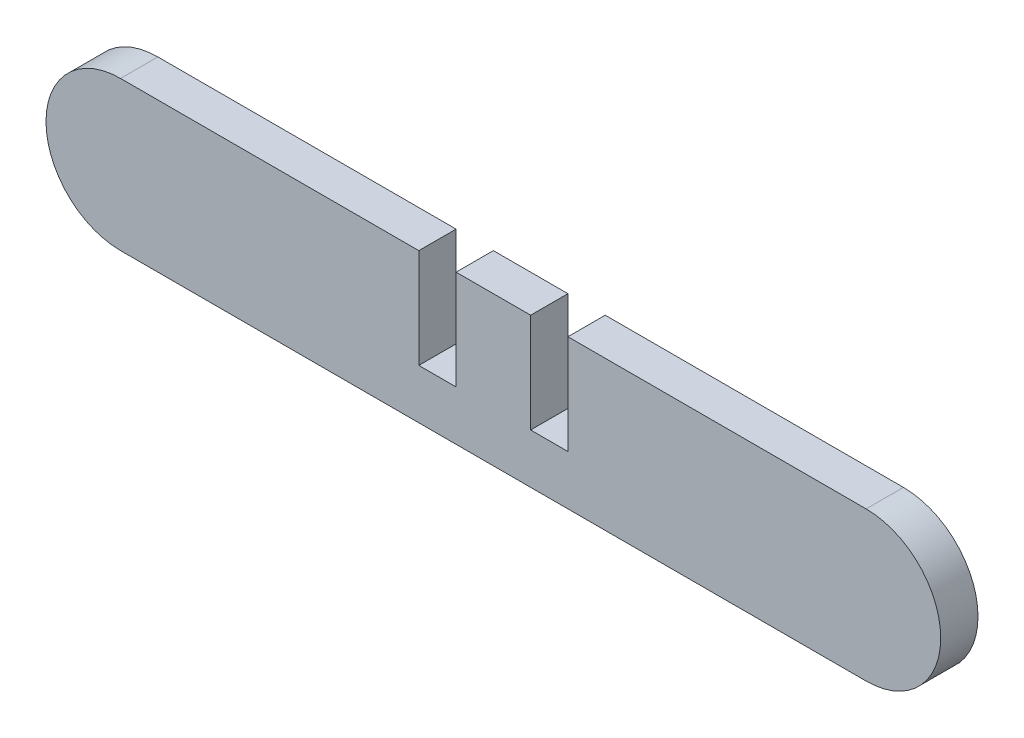
ISO-10303-21;
HEADER;
FILE_DESCRIPTION(('STEP AP214'),'2;1');
FILE_NAME('part.step','',(''),(''),'','','');
FILE_SCHEMA(('AUTOMOTIVE_DESIGN { 1 0 10303 214 1 1 1 1 }'));
ENDSEC;
DATA;
#1=APPLICATION_CONTEXT('core data for automotive mechanical design processes');
#2=APPLICATION_PROTOCOL_DEFINITION('international standard','automotive_design',2000,#1);
#3=PRODUCT_CONTEXT('',#1,'mechanical');
#4=PRODUCT('Part','Part','',(#3));
#5=PRODUCT_RELATED_PRODUCT_CATEGORY('part','',(#4));
#6=PRODUCT_DEFINITION_FORMATION('','',#4);
#7=PRODUCT_DEFINITION_CONTEXT('part definition',#1,'design');
#8=PRODUCT_DEFINITION('design','',#6,#7);
#9=PRODUCT_DEFINITION_SHAPE('','',#8);
#10=(LENGTH_UNIT() NAMED_UNIT(*) SI_UNIT(.MILLI.,.METRE.));
#11=(NAMED_UNIT(*) PLANE_ANGLE_UNIT() SI_UNIT($,.RADIAN.));
#12=(NAMED_UNIT(*) SI_UNIT($,.STERADIAN.) SOLID_ANGLE_UNIT());
#13=UNCERTAINTY_MEASURE_WITH_UNIT(LENGTH_MEASURE(1.E-05),#10,'distance_accuracy_value','');
#14=(GEOMETRIC_REPRESENTATION_CONTEXT(3) GLOBAL_UNCERTAINTY_ASSIGNED_CONTEXT((#13)) GLOBAL_UNIT_ASSIGNED_CONTEXT((#10,
#11,#12)) REPRESENTATION_CONTEXT('',''));
#15=CARTESIAN_POINT('',(0.,0.,0.));
#16=DIRECTION('',(0.,0.,1.));
#17=DIRECTION('',(1.,0.,0.));
#18=AXIS2_PLACEMENT_3D('',#15,#16,#17);
#19=CARTESIAN_POINT('',(30.,6.00000000000001,3.));
#20=DIRECTION('',(0.,-1.,0.));
#21=DIRECTION('',(1.,0.,0.));
#22=AXIS2_PLACEMENT_3D('',#19,#20,#21);
#23=PLANE('',#22);
#24=DIRECTION('',(-1.,0.,0.));
#25=VECTOR('',#24,1.);
#26=CARTESIAN_POINT('',(30.,6.00000000000001,3.));
#27=LINE('',#26,#25);
#28=CARTESIAN_POINT('',(-6.,6.00000000000001,3.));
#29=VERTEX_POINT('',#28);
#30=CARTESIAN_POINT('',(-30.,6.,3.));
#31=VERTEX_POINT('',#30);
#32=EDGE_CURVE('E170',#29,#31,#27,.T.);
#33=ORIENTED_EDGE('',*,*,#32,.F.);
#34=DIRECTION('',(0.,0.,1.));
#35=VECTOR('',#34,1.);
#36=CARTESIAN_POINT('',(-6.,6.00000000000001,-1.));
#37=LINE('',#36,#35);
#38=CARTESIAN_POINT('',(-6.,6.00000000000001,0.));
#39=VERTEX_POINT('',#38);
#40=EDGE_CURVE('E137',#39,#29,#37,.T.);
#41=ORIENTED_EDGE('',*,*,#40,.F.);
#42=DIRECTION('',(-1.,0.,0.));
#43=VECTOR('',#42,1.);
#44=CARTESIAN_POINT('',(30.,6.00000000000001,0.));
#45=LINE('',#44,#43);
#46=CARTESIAN_POINT('',(-30.,6.,0.));
#47=VERTEX_POINT('',#46);
#48=EDGE_CURVE('E183',#39,#47,#45,.T.);
#49=ORIENTED_EDGE('',*,*,#48,.T.);
#50=DIRECTION('',(0.,0.,-1.));
#51=VECTOR('',#50,1.);
#52=CARTESIAN_POINT('',(-30.,6.,3.));
#53=LINE('',#52,#51);
#54=EDGE_CURVE('E196',#31,#47,#53,.T.);
#55=ORIENTED_EDGE('',*,*,#54,.F.);
#56=EDGE_LOOP('',(#33,#41,#49,#55));
#57=FACE_BOUND('',#56,.T.);
#58=ADVANCED_FACE('F35',(#57),#23,.F.);
#59=CARTESIAN_POINT('',(30.,6.00000000000001,0.));
#60=VERTEX_POINT('',#59);
#61=CARTESIAN_POINT('',(6.,6.00000000000001,0.));
#62=VERTEX_POINT('',#61);
#63=EDGE_CURVE('E184',#60,#62,#45,.T.);
#64=ORIENTED_EDGE('',*,*,#63,.T.);
#65=DIRECTION('',(0.,0.,1.));
#66=VECTOR('',#65,1.);
#67=CARTESIAN_POINT('',(6.,6.00000000000001,-1.));
#68=LINE('',#67,#66);
#69=CARTESIAN_POINT('',(6.,6.00000000000001,3.));
#70=VERTEX_POINT('',#69);
#71=EDGE_CURVE('E140',#62,#70,#68,.T.);
#72=ORIENTED_EDGE('',*,*,#71,.T.);
#73=CARTESIAN_POINT('',(30.,6.00000000000001,3.));
#74=VERTEX_POINT('',#73);
#75=EDGE_CURVE('E172',#74,#70,#27,.T.);
#76=ORIENTED_EDGE('',*,*,#75,.F.);
#77=DIRECTION('',(0.,0.,-1.));
#78=VECTOR('',#77,1.);
#79=CARTESIAN_POINT('',(30.,6.00000000000001,3.));
#80=LINE('',#79,#78);
#81=EDGE_CURVE('E199',#74,#60,#80,.T.);
#82=ORIENTED_EDGE('',*,*,#81,.T.);
#83=EDGE_LOOP('',(#64,#72,#76,#82));
#84=FACE_BOUND('',#83,.T.);
#85=ADVANCED_FACE('F248',(#84),#23,.F.);
#86=CARTESIAN_POINT('',(30.,0.,3.));
#87=DIRECTION('',(0.,0.,-1.));
#88=DIRECTION('',(-1.,0.,0.));
#89=AXIS2_PLACEMENT_3D('',#86,#87,#88);
#90=CYLINDRICAL_SURFACE('',#89,6.);
#91=CARTESIAN_POINT('',(30.,0.,0.));
#92=DIRECTION('',(0.,0.,1.));
#93=DIRECTION('',(1.,0.,0.));
#94=AXIS2_PLACEMENT_3D('',#91,#92,#93);
#95=CIRCLE('',#94,6.);
#96=CARTESIAN_POINT('',(30.,-5.99999999999999,0.));
#97=VERTEX_POINT('',#96);
#98=EDGE_CURVE('E148',#97,#60,#95,.T.);
#99=ORIENTED_EDGE('',*,*,#98,.T.);
#100=ORIENTED_EDGE('',*,*,#81,.F.);
#101=CARTESIAN_POINT('',(30.,0.,3.));
#102=DIRECTION('',(0.,0.,1.));
#103=DIRECTION('',(1.,0.,0.));
#104=AXIS2_PLACEMENT_3D('',#101,#102,#103);
#105=CIRCLE('',#104,6.);
#106=CARTESIAN_POINT('',(30.,-5.99999999999999,3.));
#107=VERTEX_POINT('',#106);
#108=EDGE_CURVE('E167',#107,#74,#105,.T.);
#109=ORIENTED_EDGE('',*,*,#108,.F.);
#110=DIRECTION('',(0.,0.,-1.));
#111=VECTOR('',#110,1.);
#112=CARTESIAN_POINT('',(30.,-5.99999999999999,3.));
#113=LINE('',#112,#111);
#114=EDGE_CURVE('E180',#107,#97,#113,.T.);
#115=ORIENTED_EDGE('',*,*,#114,.T.);
#116=EDGE_LOOP('',(#99,#100,#109,#115));
#117=FACE_BOUND('',#116,.T.);
#118=ADVANCED_FACE('F37',(#117),#90,.T.);
#119=CARTESIAN_POINT('',(3.,6.00000000000001,0.));
#120=VERTEX_POINT('',#119);
#121=CARTESIAN_POINT('',(-3.,6.00000000000001,0.));
#122=VERTEX_POINT('',#121);
#123=EDGE_CURVE('E188',#120,#122,#45,.T.);
#124=ORIENTED_EDGE('',*,*,#123,.T.);
#125=DIRECTION('',(0.,0.,1.));
#126=VECTOR('',#125,1.);
#127=CARTESIAN_POINT('',(-3.,6.00000000000001,-1.));
#128=LINE('',#127,#126);
#129=CARTESIAN_POINT('',(-3.,6.00000000000001,3.));
#130=VERTEX_POINT('',#129);
#131=EDGE_CURVE('E149',#122,#130,#128,.T.);
#132=ORIENTED_EDGE('',*,*,#131,.T.);
#133=CARTESIAN_POINT('',(3.,6.00000000000001,3.));
#134=VERTEX_POINT('',#133);
#135=EDGE_CURVE('E176',#134,#130,#27,.T.);
#136=ORIENTED_EDGE('',*,*,#135,.F.);
#137=DIRECTION('',(0.,0.,1.));
#138=VECTOR('',#137,1.);
#139=CARTESIAN_POINT('',(3.,6.00000000000001,-1.));
#140=LINE('',#139,#138);
#141=EDGE_CURVE('E160',#120,#134,#140,.T.);
#142=ORIENTED_EDGE('',*,*,#141,.F.);
#143=EDGE_LOOP('',(#124,#132,#136,#142));
#144=FACE_BOUND('',#143,.T.);
#145=ADVANCED_FACE('F220',(#144),#23,.F.);
#146=CARTESIAN_POINT('',(-30.,0.,3.));
#147=DIRECTION('',(0.,0.,-1.));
#148=DIRECTION('',(-1.,0.,0.));
#149=AXIS2_PLACEMENT_3D('',#146,#147,#148);
#150=CYLINDRICAL_SURFACE('',#149,6.);
#151=CARTESIAN_POINT('',(-30.,0.,0.));
#152=DIRECTION('',(0.,0.,1.));
#153=DIRECTION('',(1.,0.,0.));
#154=AXIS2_PLACEMENT_3D('',#151,#152,#153);
#155=CIRCLE('',#154,6.);
#156=CARTESIAN_POINT('',(-30.,-6.00000000000001,0.));
#157=VERTEX_POINT('',#156);
#158=EDGE_CURVE('E187',#47,#157,#155,.T.);
#159=ORIENTED_EDGE('',*,*,#158,.T.);
#160=DIRECTION('',(0.,0.,-1.));
#161=VECTOR('',#160,1.);
#162=CARTESIAN_POINT('',(-30.,-6.00000000000001,3.));
#163=LINE('',#162,#161);
#164=CARTESIAN_POINT('',(-30.,-6.00000000000001,3.));
#165=VERTEX_POINT('',#164);
#166=EDGE_CURVE('E193',#165,#157,#163,.T.);
#167=ORIENTED_EDGE('',*,*,#166,.F.);
#168=CARTESIAN_POINT('',(-30.,0.,3.));
#169=DIRECTION('',(0.,0.,1.));
#170=DIRECTION('',(1.,0.,0.));
#171=AXIS2_PLACEMENT_3D('',#168,#169,#170);
#172=CIRCLE('',#171,6.);
#173=EDGE_CURVE('E175',#31,#165,#172,.T.);
#174=ORIENTED_EDGE('',*,*,#173,.F.);
#175=ORIENTED_EDGE('',*,*,#54,.T.);
#176=EDGE_LOOP('',(#159,#167,#174,#175));
#177=FACE_BOUND('',#176,.T.);
#178=ADVANCED_FACE('F227',(#177),#150,.T.);
#179=CARTESIAN_POINT('',(30.,-5.99999999999999,3.));
#180=DIRECTION('',(0.,1.,0.));
#181=DIRECTION('',(-1.,0.,0.));
#182=AXIS2_PLACEMENT_3D('',#179,#180,#181);
#183=PLANE('',#182);
#184=DIRECTION('',(1.,0.,0.));
#185=VECTOR('',#184,1.);
#186=CARTESIAN_POINT('',(30.,-5.99999999999999,0.));
#187=LINE('',#186,#185);
#188=EDGE_CURVE('E171',#157,#97,#187,.T.);
#189=ORIENTED_EDGE('',*,*,#188,.T.);
#190=ORIENTED_EDGE('',*,*,#114,.F.);
#191=DIRECTION('',(1.,0.,0.));
#192=VECTOR('',#191,1.);
#193=CARTESIAN_POINT('',(30.,-5.99999999999999,3.));
#194=LINE('',#193,#192);
#195=EDGE_CURVE('E178',#165,#107,#194,.T.);
#196=ORIENTED_EDGE('',*,*,#195,.F.);
#197=ORIENTED_EDGE('',*,*,#166,.T.);
#198=EDGE_LOOP('',(#189,#190,#196,#197));
#199=FACE_BOUND('',#198,.T.);
#200=ADVANCED_FACE('F233',(#199),#183,.F.);
#201=CARTESIAN_POINT('',(30.,0.,3.));
#202=DIRECTION('',(0.,0.,1.));
#203=DIRECTION('',(1.,0.,0.));
#204=AXIS2_PLACEMENT_3D('',#201,#202,#203);
#205=PLANE('',#204);
#206=DIRECTION('',(0.,-1.,0.));
#207=VECTOR('',#206,1.);
#208=CARTESIAN_POINT('',(-6.,6.00000000000001,3.));
#209=LINE('',#208,#207);
#210=CARTESIAN_POINT('',(-6.,-1.99999999999999,3.));
#211=VERTEX_POINT('',#210);
#212=EDGE_CURVE('E134',#29,#211,#209,.T.);
#213=ORIENTED_EDGE('',*,*,#212,.F.);
#214=ORIENTED_EDGE('',*,*,#32,.T.);
#215=ORIENTED_EDGE('',*,*,#173,.T.);
#216=ORIENTED_EDGE('',*,*,#195,.T.);
#217=ORIENTED_EDGE('',*,*,#108,.T.);
#218=ORIENTED_EDGE('',*,*,#75,.T.);
#219=DIRECTION('',(0.,1.,0.));
#220=VECTOR('',#219,1.);
#221=CARTESIAN_POINT('',(6.,6.00000000000001,3.));
#222=LINE('',#221,#220);
#223=CARTESIAN_POINT('',(6.,-1.99999999999999,3.));
#224=VERTEX_POINT('',#223);
#225=EDGE_CURVE('E158',#224,#70,#222,.T.);
#226=ORIENTED_EDGE('',*,*,#225,.F.);
#227=DIRECTION('',(1.,0.,0.));
#228=VECTOR('',#227,1.);
#229=CARTESIAN_POINT('',(3.,-1.99999999999999,3.));
#230=LINE('',#229,#228);
#231=CARTESIAN_POINT('',(3.,-1.99999999999999,3.));
#232=VERTEX_POINT('',#231);
#233=EDGE_CURVE('E155',#232,#224,#230,.T.);
#234=ORIENTED_EDGE('',*,*,#233,.F.);
#235=DIRECTION('',(0.,-1.,0.));
#236=VECTOR('',#235,1.);
#237=CARTESIAN_POINT('',(3.,6.00000000000001,3.));
#238=LINE('',#237,#236);
#239=EDGE_CURVE('E153',#134,#232,#238,.T.);
#240=ORIENTED_EDGE('',*,*,#239,.F.);
#241=ORIENTED_EDGE('',*,*,#135,.T.);
#242=DIRECTION('',(0.,1.,0.));
#243=VECTOR('',#242,1.);
#244=CARTESIAN_POINT('',(-3.,6.00000000000001,3.));
#245=LINE('',#244,#243);
#246=CARTESIAN_POINT('',(-3.,-1.99999999999999,3.));
#247=VERTEX_POINT('',#246);
#248=EDGE_CURVE('E131',#247,#130,#245,.T.);
#249=ORIENTED_EDGE('',*,*,#248,.F.);
#250=DIRECTION('',(1.,0.,0.));
#251=VECTOR('',#250,1.);
#252=CARTESIAN_POINT('',(-3.,-1.99999999999999,3.));
#253=LINE('',#252,#251);
#254=EDGE_CURVE('E126',#211,#247,#253,.T.);
#255=ORIENTED_EDGE('',*,*,#254,.F.);
#256=EDGE_LOOP('',(#213,#214,#215,#216,#217,#218,#226,#234,#240,#241,#249,#255));
#257=FACE_BOUND('',#256,.T.);
#258=ADVANCED_FACE('F142',(#257),#205,.T.);
#259=CARTESIAN_POINT('',(30.,0.,0.));
#260=DIRECTION('',(0.,0.,1.));
#261=DIRECTION('',(1.,0.,0.));
#262=AXIS2_PLACEMENT_3D('',#259,#260,#261);
#263=PLANE('',#262);
#264=ORIENTED_EDGE('',*,*,#48,.F.);
#265=DIRECTION('',(0.,-1.,0.));
#266=VECTOR('',#265,1.);
#267=CARTESIAN_POINT('',(-6.,0.,0.));
#268=LINE('',#267,#266);
#269=CARTESIAN_POINT('',(-6.,-1.99999999999999,0.));
#270=VERTEX_POINT('',#269);
#271=EDGE_CURVE('E11',#39,#270,#268,.T.);
#272=ORIENTED_EDGE('',*,*,#271,.T.);
#273=DIRECTION('',(1.,0.,0.));
#274=VECTOR('',#273,1.);
#275=CARTESIAN_POINT('',(30.,-2.,0.));
#276=LINE('',#275,#274);
#277=CARTESIAN_POINT('',(-3.,-1.99999999999999,0.));
#278=VERTEX_POINT('',#277);
#279=EDGE_CURVE('E129',#270,#278,#276,.T.);
#280=ORIENTED_EDGE('',*,*,#279,.T.);
#281=DIRECTION('',(0.,1.,0.));
#282=VECTOR('',#281,1.);
#283=CARTESIAN_POINT('',(-3.,0.,0.));
#284=LINE('',#283,#282);
#285=EDGE_CURVE('E43',#278,#122,#284,.T.);
#286=ORIENTED_EDGE('',*,*,#285,.T.);
#287=ORIENTED_EDGE('',*,*,#123,.F.);
#288=DIRECTION('',(0.,-1.,0.));
#289=VECTOR('',#288,1.);
#290=CARTESIAN_POINT('',(3.,0.,0.));
#291=LINE('',#290,#289);
#292=CARTESIAN_POINT('',(3.,-1.99999999999999,0.));
#293=VERTEX_POINT('',#292);
#294=EDGE_CURVE('E202',#120,#293,#291,.T.);
#295=ORIENTED_EDGE('',*,*,#294,.T.);
#296=DIRECTION('',(1.,0.,0.));
#297=VECTOR('',#296,1.);
#298=CARTESIAN_POINT('',(30.,-1.99999999999998,0.));
#299=LINE('',#298,#297);
#300=CARTESIAN_POINT('',(6.,-1.99999999999999,0.));
#301=VERTEX_POINT('',#300);
#302=EDGE_CURVE('E205',#293,#301,#299,.T.);
#303=ORIENTED_EDGE('',*,*,#302,.T.);
#304=DIRECTION('',(0.,1.,0.));
#305=VECTOR('',#304,1.);
#306=CARTESIAN_POINT('',(6.,0.,0.));
#307=LINE('',#306,#305);
#308=EDGE_CURVE('E208',#301,#62,#307,.T.);
#309=ORIENTED_EDGE('',*,*,#308,.T.);
#310=ORIENTED_EDGE('',*,*,#63,.F.);
#311=ORIENTED_EDGE('',*,*,#98,.F.);
#312=ORIENTED_EDGE('',*,*,#188,.F.);
#313=ORIENTED_EDGE('',*,*,#158,.F.);
#314=EDGE_LOOP('',(#264,#272,#280,#286,#287,#295,#303,#309,#310,#311,#312,#313));
#315=FACE_BOUND('',#314,.T.);
#316=ADVANCED_FACE('F216',(#315),#263,.F.);
#317=CARTESIAN_POINT('',(6.,6.00000000000001,-1.));
#318=DIRECTION('',(1.,0.,0.));
#319=DIRECTION('',(0.,0.,-1.));
#320=AXIS2_PLACEMENT_3D('',#317,#318,#319);
#321=PLANE('',#320);
#322=DIRECTION('',(0.,0.,1.));
#323=VECTOR('',#322,1.);
#324=CARTESIAN_POINT('',(6.,-1.99999999999999,-1.));
#325=LINE('',#324,#323);
#326=EDGE_CURVE('E163',#301,#224,#325,.T.);
#327=ORIENTED_EDGE('',*,*,#326,.T.);
#328=ORIENTED_EDGE('',*,*,#225,.T.);
#329=ORIENTED_EDGE('',*,*,#71,.F.);
#330=ORIENTED_EDGE('',*,*,#308,.F.);
#331=EDGE_LOOP('',(#327,#328,#329,#330));
#332=FACE_BOUND('',#331,.T.);
#333=ADVANCED_FACE('F246',(#332),#321,.F.);
#334=CARTESIAN_POINT('',(3.,-1.99999999999999,-1.));
#335=DIRECTION('',(0.,-1.,0.));
#336=DIRECTION('',(1.,0.,0.));
#337=AXIS2_PLACEMENT_3D('',#334,#335,#336);
#338=PLANE('',#337);
#339=DIRECTION('',(0.,0.,1.));
#340=VECTOR('',#339,1.);
#341=CARTESIAN_POINT('',(3.,-1.99999999999999,-1.));
#342=LINE('',#341,#340);
#343=EDGE_CURVE('E58',#293,#232,#342,.T.);
#344=ORIENTED_EDGE('',*,*,#343,.T.);
#345=ORIENTED_EDGE('',*,*,#233,.T.);
#346=ORIENTED_EDGE('',*,*,#326,.F.);
#347=ORIENTED_EDGE('',*,*,#302,.F.);
#348=EDGE_LOOP('',(#344,#345,#346,#347));
#349=FACE_BOUND('',#348,.T.);
#350=ADVANCED_FACE('F244',(#349),#338,.F.);
#351=CARTESIAN_POINT('',(3.,6.00000000000001,-1.));
#352=DIRECTION('',(-1.,0.,0.));
#353=DIRECTION('',(0.,-1.,0.));
#354=AXIS2_PLACEMENT_3D('',#351,#352,#353);
#355=PLANE('',#354);
#356=ORIENTED_EDGE('',*,*,#141,.T.);
#357=ORIENTED_EDGE('',*,*,#239,.T.);
#358=ORIENTED_EDGE('',*,*,#343,.F.);
#359=ORIENTED_EDGE('',*,*,#294,.F.);
#360=EDGE_LOOP('',(#356,#357,#358,#359));
#361=FACE_BOUND('',#360,.T.);
#362=ADVANCED_FACE('F241',(#361),#355,.F.);
#363=CARTESIAN_POINT('',(-6.,6.00000000000001,-1.));
#364=DIRECTION('',(-1.,0.,0.));
#365=DIRECTION('',(0.,0.,1.));
#366=AXIS2_PLACEMENT_3D('',#363,#364,#365);
#367=PLANE('',#366);
#368=ORIENTED_EDGE('',*,*,#40,.T.);
#369=ORIENTED_EDGE('',*,*,#212,.T.);
#370=DIRECTION('',(0.,0.,1.));
#371=VECTOR('',#370,1.);
#372=CARTESIAN_POINT('',(-6.,-1.99999999999999,-1.));
#373=LINE('',#372,#371);
#374=EDGE_CURVE('E122',#270,#211,#373,.T.);
#375=ORIENTED_EDGE('',*,*,#374,.F.);
#376=ORIENTED_EDGE('',*,*,#271,.F.);
#377=EDGE_LOOP('',(#368,#369,#375,#376));
#378=FACE_BOUND('',#377,.T.);
#379=ADVANCED_FACE('F135',(#378),#367,.F.);
#380=CARTESIAN_POINT('',(-3.,6.00000000000001,-1.));
#381=DIRECTION('',(1.,0.,0.));
#382=DIRECTION('',(0.,0.,-1.));
#383=AXIS2_PLACEMENT_3D('',#380,#381,#382);
#384=PLANE('',#383);
#385=DIRECTION('',(0.,0.,1.));
#386=VECTOR('',#385,1.);
#387=CARTESIAN_POINT('',(-3.,-1.99999999999999,-1.));
#388=LINE('',#387,#386);
#389=EDGE_CURVE('E50',#278,#247,#388,.T.);
#390=ORIENTED_EDGE('',*,*,#389,.T.);
#391=ORIENTED_EDGE('',*,*,#248,.T.);
#392=ORIENTED_EDGE('',*,*,#131,.F.);
#393=ORIENTED_EDGE('',*,*,#285,.F.);
#394=EDGE_LOOP('',(#390,#391,#392,#393));
#395=FACE_BOUND('',#394,.T.);
#396=ADVANCED_FACE('F276',(#395),#384,.F.);
#397=CARTESIAN_POINT('',(-3.,-1.99999999999999,-1.));
#398=DIRECTION('',(0.,-1.,0.));
#399=DIRECTION('',(1.,0.,0.));
#400=AXIS2_PLACEMENT_3D('',#397,#398,#399);
#401=PLANE('',#400);
#402=ORIENTED_EDGE('',*,*,#374,.T.);
#403=ORIENTED_EDGE('',*,*,#254,.T.);
#404=ORIENTED_EDGE('',*,*,#389,.F.);
#405=ORIENTED_EDGE('',*,*,#279,.F.);
#406=EDGE_LOOP('',(#402,#403,#404,#405));
#407=FACE_BOUND('',#406,.T.);
#408=ADVANCED_FACE('F124',(#407),#401,.F.);
#409=CLOSED_SHELL('',(#58,#85,#118,#145,#178,#200,#258,#316,#333,#350,#362,#379,#396,#408));
#410=MANIFOLD_SOLID_BREP('B2',#409);
#411=ADVANCED_BREP_SHAPE_REPRESENTATION('',(#18,#410),#14);
#412=SHAPE_DEFINITION_REPRESENTATION(#9,#411);
ENDSEC;
END-ISO-10303-21;
